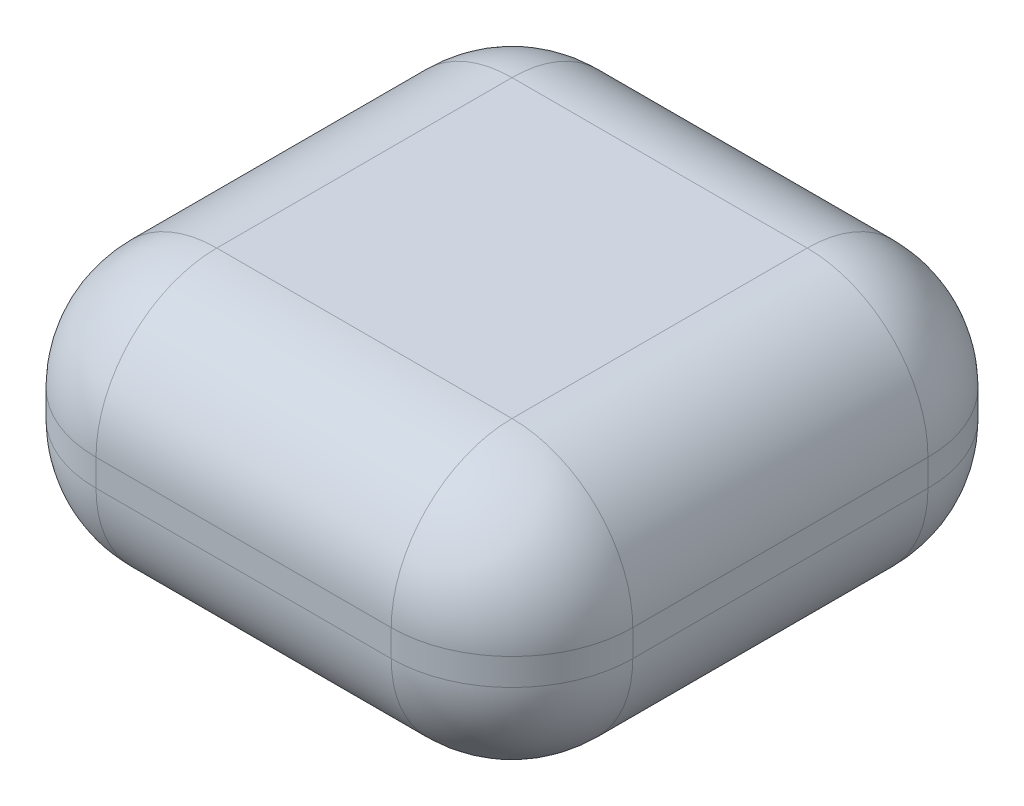
ISO-10303-21;
HEADER;
FILE_DESCRIPTION(('STEP AP214'),'2;1');
FILE_NAME('part.step','',(''),(''),'','','');
FILE_SCHEMA(('AUTOMOTIVE_DESIGN { 1 0 10303 214 1 1 1 1 }'));
ENDSEC;
DATA;
#1=APPLICATION_CONTEXT('core data for automotive mechanical design processes');
#2=APPLICATION_PROTOCOL_DEFINITION('international standard','automotive_design',2000,#1);
#3=PRODUCT_CONTEXT('',#1,'mechanical');
#4=PRODUCT('Part','Part','',(#3));
#5=PRODUCT_RELATED_PRODUCT_CATEGORY('part','',(#4));
#6=PRODUCT_DEFINITION_FORMATION('','',#4);
#7=PRODUCT_DEFINITION_CONTEXT('part definition',#1,'design');
#8=PRODUCT_DEFINITION('design','',#6,#7);
#9=PRODUCT_DEFINITION_SHAPE('','',#8);
#10=(LENGTH_UNIT() NAMED_UNIT(*) SI_UNIT(.MILLI.,.METRE.));
#11=(NAMED_UNIT(*) PLANE_ANGLE_UNIT() SI_UNIT($,.RADIAN.));
#12=(NAMED_UNIT(*) SI_UNIT($,.STERADIAN.) SOLID_ANGLE_UNIT());
#13=UNCERTAINTY_MEASURE_WITH_UNIT(LENGTH_MEASURE(1.E-05),#10,'distance_accuracy_value','');
#14=(GEOMETRIC_REPRESENTATION_CONTEXT(3) GLOBAL_UNCERTAINTY_ASSIGNED_CONTEXT((#13)) GLOBAL_UNIT_ASSIGNED_CONTEXT((#10,
#11,#12)) REPRESENTATION_CONTEXT('',''));
#15=CARTESIAN_POINT('',(0.,0.,0.));
#16=DIRECTION('',(0.,0.,1.));
#17=DIRECTION('',(1.,0.,0.));
#18=AXIS2_PLACEMENT_3D('',#15,#16,#17);
#19=CARTESIAN_POINT('',(100.,-50.,100.));
#20=DIRECTION('',(-1.,0.,0.));
#21=DIRECTION('',(0.,0.,1.));
#22=AXIS2_PLACEMENT_3D('',#19,#20,#21);
#23=PLANE('',#22);
#24=DIRECTION('',(0.,1.,0.));
#25=VECTOR('',#24,1.);
#26=CARTESIAN_POINT('',(100.,-50.,55.));
#27=LINE('',#26,#25);
#28=CARTESIAN_POINT('',(100.,5.,55.));
#29=VERTEX_POINT('',#28);
#30=CARTESIAN_POINT('',(100.,-5.,55.));
#31=VERTEX_POINT('',#30);
#32=EDGE_CURVE('E206',#29,#31,#27,.F.);
#33=ORIENTED_EDGE('',*,*,#32,.T.);
#34=DIRECTION('',(0.,0.,-1.));
#35=VECTOR('',#34,1.);
#36=CARTESIAN_POINT('',(100.,-5.,100.));
#37=LINE('',#36,#35);
#38=CARTESIAN_POINT('',(100.,-5.,-55.));
#39=VERTEX_POINT('',#38);
#40=EDGE_CURVE('E212',#31,#39,#37,.T.);
#41=ORIENTED_EDGE('',*,*,#40,.T.);
#42=DIRECTION('',(0.,1.,0.));
#43=VECTOR('',#42,1.);
#44=CARTESIAN_POINT('',(100.,50.,-55.));
#45=LINE('',#44,#43);
#46=CARTESIAN_POINT('',(100.,5.,-55.));
#47=VERTEX_POINT('',#46);
#48=EDGE_CURVE('E209',#39,#47,#45,.T.);
#49=ORIENTED_EDGE('',*,*,#48,.T.);
#50=DIRECTION('',(0.,0.,-1.));
#51=VECTOR('',#50,1.);
#52=CARTESIAN_POINT('',(100.,5.,100.));
#53=LINE('',#52,#51);
#54=EDGE_CURVE('E203',#47,#29,#53,.F.);
#55=ORIENTED_EDGE('',*,*,#54,.T.);
#56=EDGE_LOOP('',(#33,#41,#49,#55));
#57=FACE_BOUND('',#56,.T.);
#58=ADVANCED_FACE('F39',(#57),#23,.F.);
#59=CARTESIAN_POINT('',(-100.,50.,100.));
#60=DIRECTION('',(0.,-1.,0.));
#61=DIRECTION('',(0.,0.,-1.));
#62=AXIS2_PLACEMENT_3D('',#59,#60,#61);
#63=PLANE('',#62);
#64=DIRECTION('',(-1.,0.,0.));
#65=VECTOR('',#64,1.);
#66=CARTESIAN_POINT('',(-100.,50.,55.));
#67=LINE('',#66,#65);
#68=CARTESIAN_POINT('',(-55.,50.,55.));
#69=VERTEX_POINT('',#68);
#70=CARTESIAN_POINT('',(55.,50.,55.));
#71=VERTEX_POINT('',#70);
#72=EDGE_CURVE('E49',#69,#71,#67,.F.);
#73=ORIENTED_EDGE('',*,*,#72,.T.);
#74=DIRECTION('',(0.,0.,-1.));
#75=VECTOR('',#74,1.);
#76=CARTESIAN_POINT('',(55.,50.,100.));
#77=LINE('',#76,#75);
#78=CARTESIAN_POINT('',(55.,50.,-55.));
#79=VERTEX_POINT('',#78);
#80=EDGE_CURVE('E11',#71,#79,#77,.T.);
#81=ORIENTED_EDGE('',*,*,#80,.T.);
#82=DIRECTION('',(-1.,0.,0.));
#83=VECTOR('',#82,1.);
#84=CARTESIAN_POINT('',(-100.,50.,-55.));
#85=LINE('',#84,#83);
#86=CARTESIAN_POINT('',(-55.,50.,-55.));
#87=VERTEX_POINT('',#86);
#88=EDGE_CURVE('E228',#79,#87,#85,.T.);
#89=ORIENTED_EDGE('',*,*,#88,.T.);
#90=DIRECTION('',(0.,0.,-1.));
#91=VECTOR('',#90,1.);
#92=CARTESIAN_POINT('',(-55.,50.,100.));
#93=LINE('',#92,#91);
#94=EDGE_CURVE('E60',#87,#69,#93,.F.);
#95=ORIENTED_EDGE('',*,*,#94,.T.);
#96=EDGE_LOOP('',(#73,#81,#89,#95));
#97=FACE_BOUND('',#96,.T.);
#98=ADVANCED_FACE('F346',(#97),#63,.F.);
#99=CARTESIAN_POINT('',(-100.,-50.,100.));
#100=DIRECTION('',(1.,0.,0.));
#101=DIRECTION('',(0.,0.,-1.));
#102=AXIS2_PLACEMENT_3D('',#99,#100,#101);
#103=PLANE('',#102);
#104=DIRECTION('',(0.,0.,-1.));
#105=VECTOR('',#104,1.);
#106=CARTESIAN_POINT('',(-100.,5.,100.));
#107=LINE('',#106,#105);
#108=CARTESIAN_POINT('',(-100.,5.,55.));
#109=VERTEX_POINT('',#108);
#110=CARTESIAN_POINT('',(-100.,5.,-55.));
#111=VERTEX_POINT('',#110);
#112=EDGE_CURVE('E132',#109,#111,#107,.T.);
#113=ORIENTED_EDGE('',*,*,#112,.T.);
#114=DIRECTION('',(0.,-1.,0.));
#115=VECTOR('',#114,1.);
#116=CARTESIAN_POINT('',(-100.,-50.,-55.));
#117=LINE('',#116,#115);
#118=CARTESIAN_POINT('',(-100.,-5.,-55.));
#119=VERTEX_POINT('',#118);
#120=EDGE_CURVE('E174',#111,#119,#117,.T.);
#121=ORIENTED_EDGE('',*,*,#120,.T.);
#122=DIRECTION('',(0.,0.,-1.));
#123=VECTOR('',#122,1.);
#124=CARTESIAN_POINT('',(-100.,-5.,100.));
#125=LINE('',#124,#123);
#126=CARTESIAN_POINT('',(-100.,-5.,55.));
#127=VERTEX_POINT('',#126);
#128=EDGE_CURVE('E135',#119,#127,#125,.F.);
#129=ORIENTED_EDGE('',*,*,#128,.T.);
#130=DIRECTION('',(0.,-1.,0.));
#131=VECTOR('',#130,1.);
#132=CARTESIAN_POINT('',(-100.,-50.,55.));
#133=LINE('',#132,#131);
#134=EDGE_CURVE('E127',#127,#109,#133,.F.);
#135=ORIENTED_EDGE('',*,*,#134,.T.);
#136=EDGE_LOOP('',(#113,#121,#129,#135));
#137=FACE_BOUND('',#136,.T.);
#138=ADVANCED_FACE('F129',(#137),#103,.F.);
#139=CARTESIAN_POINT('',(-100.,-50.,100.));
#140=DIRECTION('',(0.,1.,0.));
#141=DIRECTION('',(0.,0.,1.));
#142=AXIS2_PLACEMENT_3D('',#139,#140,#141);
#143=PLANE('',#142);
#144=DIRECTION('',(1.,0.,0.));
#145=VECTOR('',#144,1.);
#146=CARTESIAN_POINT('',(-100.,-50.,55.));
#147=LINE('',#146,#145);
#148=CARTESIAN_POINT('',(55.,-50.,55.));
#149=VERTEX_POINT('',#148);
#150=CARTESIAN_POINT('',(-55.,-50.,55.));
#151=VERTEX_POINT('',#150);
#152=EDGE_CURVE('E190',#149,#151,#147,.F.);
#153=ORIENTED_EDGE('',*,*,#152,.T.);
#154=DIRECTION('',(0.,0.,-1.));
#155=VECTOR('',#154,1.);
#156=CARTESIAN_POINT('',(-55.,-50.,100.));
#157=LINE('',#156,#155);
#158=CARTESIAN_POINT('',(-55.,-50.,-55.));
#159=VERTEX_POINT('',#158);
#160=EDGE_CURVE('E199',#151,#159,#157,.T.);
#161=ORIENTED_EDGE('',*,*,#160,.T.);
#162=DIRECTION('',(1.,0.,0.));
#163=VECTOR('',#162,1.);
#164=CARTESIAN_POINT('',(100.,-50.,-55.));
#165=LINE('',#164,#163);
#166=CARTESIAN_POINT('',(55.,-50.,-55.));
#167=VERTEX_POINT('',#166);
#168=EDGE_CURVE('E196',#159,#167,#165,.T.);
#169=ORIENTED_EDGE('',*,*,#168,.T.);
#170=DIRECTION('',(0.,0.,-1.));
#171=VECTOR('',#170,1.);
#172=CARTESIAN_POINT('',(55.,-50.,100.));
#173=LINE('',#172,#171);
#174=EDGE_CURVE('E193',#167,#149,#173,.F.);
#175=ORIENTED_EDGE('',*,*,#174,.T.);
#176=EDGE_LOOP('',(#153,#161,#169,#175));
#177=FACE_BOUND('',#176,.T.);
#178=ADVANCED_FACE('F329',(#177),#143,.F.);
#179=CARTESIAN_POINT('',(0.,0.,100.));
#180=DIRECTION('',(0.,0.,-1.));
#181=DIRECTION('',(-1.,0.,0.));
#182=AXIS2_PLACEMENT_3D('',#179,#180,#181);
#183=PLANE('',#182);
#184=DIRECTION('',(0.,-1.,0.));
#185=VECTOR('',#184,1.);
#186=CARTESIAN_POINT('',(-55.,0.,100.));
#187=LINE('',#186,#185);
#188=CARTESIAN_POINT('',(-55.,5.,100.));
#189=VERTEX_POINT('',#188);
#190=CARTESIAN_POINT('',(-55.,-5.,100.));
#191=VERTEX_POINT('',#190);
#192=EDGE_CURVE('E146',#189,#191,#187,.T.);
#193=ORIENTED_EDGE('',*,*,#192,.T.);
#194=DIRECTION('',(1.,0.,0.));
#195=VECTOR('',#194,1.);
#196=CARTESIAN_POINT('',(0.,-5.,100.));
#197=LINE('',#196,#195);
#198=CARTESIAN_POINT('',(55.,-5.,100.));
#199=VERTEX_POINT('',#198);
#200=EDGE_CURVE('E224',#191,#199,#197,.T.);
#201=ORIENTED_EDGE('',*,*,#200,.T.);
#202=DIRECTION('',(0.,1.,0.));
#203=VECTOR('',#202,1.);
#204=CARTESIAN_POINT('',(55.,0.,100.));
#205=LINE('',#204,#203);
#206=CARTESIAN_POINT('',(55.,5.,100.));
#207=VERTEX_POINT('',#206);
#208=EDGE_CURVE('E219',#199,#207,#205,.T.);
#209=ORIENTED_EDGE('',*,*,#208,.T.);
#210=DIRECTION('',(-1.,0.,0.));
#211=VECTOR('',#210,1.);
#212=CARTESIAN_POINT('',(0.,5.,100.));
#213=LINE('',#212,#211);
#214=EDGE_CURVE('E216',#207,#189,#213,.T.);
#215=ORIENTED_EDGE('',*,*,#214,.T.);
#216=EDGE_LOOP('',(#193,#201,#209,#215));
#217=FACE_BOUND('',#216,.T.);
#218=ADVANCED_FACE('F316',(#217),#183,.F.);
#219=CARTESIAN_POINT('',(0.,0.,-100.));
#220=DIRECTION('',(0.,0.,-1.));
#221=DIRECTION('',(-1.,0.,0.));
#222=AXIS2_PLACEMENT_3D('',#219,#220,#221);
#223=PLANE('',#222);
#224=DIRECTION('',(1.,0.,0.));
#225=VECTOR('',#224,1.);
#226=CARTESIAN_POINT('',(-100.,-5.,-100.));
#227=LINE('',#226,#225);
#228=CARTESIAN_POINT('',(55.,-5.,-100.));
#229=VERTEX_POINT('',#228);
#230=CARTESIAN_POINT('',(-55.,-5.,-100.));
#231=VERTEX_POINT('',#230);
#232=EDGE_CURVE('E183',#229,#231,#227,.F.);
#233=ORIENTED_EDGE('',*,*,#232,.T.);
#234=DIRECTION('',(0.,-1.,0.));
#235=VECTOR('',#234,1.);
#236=CARTESIAN_POINT('',(-55.,50.,-100.));
#237=LINE('',#236,#235);
#238=CARTESIAN_POINT('',(-55.,5.,-100.));
#239=VERTEX_POINT('',#238);
#240=EDGE_CURVE('E186',#231,#239,#237,.F.);
#241=ORIENTED_EDGE('',*,*,#240,.T.);
#242=DIRECTION('',(-1.,0.,0.));
#243=VECTOR('',#242,1.);
#244=CARTESIAN_POINT('',(100.,5.,-100.));
#245=LINE('',#244,#243);
#246=CARTESIAN_POINT('',(55.,5.,-100.));
#247=VERTEX_POINT('',#246);
#248=EDGE_CURVE('E177',#239,#247,#245,.F.);
#249=ORIENTED_EDGE('',*,*,#248,.T.);
#250=DIRECTION('',(0.,1.,0.));
#251=VECTOR('',#250,1.);
#252=CARTESIAN_POINT('',(55.,-50.,-100.));
#253=LINE('',#252,#251);
#254=EDGE_CURVE('E180',#247,#229,#253,.F.);
#255=ORIENTED_EDGE('',*,*,#254,.T.);
#256=EDGE_LOOP('',(#233,#241,#249,#255));
#257=FACE_BOUND('',#256,.T.);
#258=ADVANCED_FACE('F532',(#257),#223,.T.);
#259=CARTESIAN_POINT('',(55.,0.,55.));
#260=DIRECTION('',(0.,1.,0.));
#261=DIRECTION('',(0.,0.,1.));
#262=AXIS2_PLACEMENT_3D('',#259,#260,#261);
#263=CYLINDRICAL_SURFACE('',#262,45.);
#264=CARTESIAN_POINT('',(55.,5.,55.));
#265=DIRECTION('',(0.,1.,0.));
#266=DIRECTION('',(0.,0.,1.));
#267=AXIS2_PLACEMENT_3D('',#264,#265,#266);
#268=CIRCLE('',#267,45.);
#269=EDGE_CURVE('E43',#207,#29,#268,.T.);
#270=ORIENTED_EDGE('',*,*,#269,.F.);
#271=ORIENTED_EDGE('',*,*,#208,.F.);
#272=CARTESIAN_POINT('',(55.,-5.,55.));
#273=DIRECTION('',(0.,-1.,0.));
#274=DIRECTION('',(0.,0.,-1.));
#275=AXIS2_PLACEMENT_3D('',#272,#273,#274);
#276=CIRCLE('',#275,45.);
#277=EDGE_CURVE('E170',#31,#199,#276,.T.);
#278=ORIENTED_EDGE('',*,*,#277,.F.);
#279=ORIENTED_EDGE('',*,*,#32,.F.);
#280=EDGE_LOOP('',(#270,#271,#278,#279));
#281=FACE_BOUND('',#280,.T.);
#282=ADVANCED_FACE('F41',(#281),#263,.T.);
#283=CARTESIAN_POINT('',(55.,5.,55.));
#284=DIRECTION('',(0.,0.,1.));
#285=DIRECTION('',(1.,0.,0.));
#286=AXIS2_PLACEMENT_3D('',#283,#284,#285);
#287=SPHERICAL_SURFACE('',#286,45.);
#288=CARTESIAN_POINT('',(55.,5.,55.));
#289=DIRECTION('',(1.,0.,0.));
#290=DIRECTION('',(0.,0.,-1.));
#291=AXIS2_PLACEMENT_3D('',#288,#289,#290);
#292=CIRCLE('',#291,45.);
#293=EDGE_CURVE('E294',#207,#71,#292,.F.);
#294=ORIENTED_EDGE('',*,*,#293,.F.);
#295=ORIENTED_EDGE('',*,*,#269,.T.);
#296=CARTESIAN_POINT('',(55.,5.,55.));
#297=DIRECTION('',(0.,0.,1.));
#298=DIRECTION('',(1.,0.,0.));
#299=AXIS2_PLACEMENT_3D('',#296,#297,#298);
#300=CIRCLE('',#299,45.);
#301=EDGE_CURVE('E297',#71,#29,#300,.F.);
#302=ORIENTED_EDGE('',*,*,#301,.F.);
#303=EDGE_LOOP('',(#294,#295,#302));
#304=FACE_BOUND('',#303,.T.);
#305=ADVANCED_FACE('F339',(#304),#287,.T.);
#306=CARTESIAN_POINT('',(55.,-5.,55.));
#307=DIRECTION('',(0.,0.,1.));
#308=DIRECTION('',(1.,0.,0.));
#309=AXIS2_PLACEMENT_3D('',#306,#307,#308);
#310=SPHERICAL_SURFACE('',#309,45.);
#311=CARTESIAN_POINT('',(55.,-5.,55.));
#312=DIRECTION('',(0.,0.,1.));
#313=DIRECTION('',(1.,0.,0.));
#314=AXIS2_PLACEMENT_3D('',#311,#312,#313);
#315=CIRCLE('',#314,45.);
#316=EDGE_CURVE('E287',#31,#149,#315,.F.);
#317=ORIENTED_EDGE('',*,*,#316,.F.);
#318=ORIENTED_EDGE('',*,*,#277,.T.);
#319=CARTESIAN_POINT('',(55.,-5.,55.));
#320=DIRECTION('',(1.,0.,0.));
#321=DIRECTION('',(0.,0.,-1.));
#322=AXIS2_PLACEMENT_3D('',#319,#320,#321);
#323=CIRCLE('',#322,45.);
#324=EDGE_CURVE('E291',#149,#199,#323,.F.);
#325=ORIENTED_EDGE('',*,*,#324,.F.);
#326=EDGE_LOOP('',(#317,#318,#325));
#327=FACE_BOUND('',#326,.T.);
#328=ADVANCED_FACE('F307',(#327),#310,.T.);
#329=CARTESIAN_POINT('',(55.,5.,100.));
#330=DIRECTION('',(0.,0.,-1.));
#331=DIRECTION('',(-1.,0.,0.));
#332=AXIS2_PLACEMENT_3D('',#329,#330,#331);
#333=CYLINDRICAL_SURFACE('',#332,45.);
#334=ORIENTED_EDGE('',*,*,#301,.T.);
#335=ORIENTED_EDGE('',*,*,#54,.F.);
#336=CARTESIAN_POINT('',(55.,5.,-55.));
#337=DIRECTION('',(0.,0.,-1.));
#338=DIRECTION('',(-1.,0.,0.));
#339=AXIS2_PLACEMENT_3D('',#336,#337,#338);
#340=CIRCLE('',#339,45.);
#341=EDGE_CURVE('E279',#79,#47,#340,.T.);
#342=ORIENTED_EDGE('',*,*,#341,.F.);
#343=ORIENTED_EDGE('',*,*,#80,.F.);
#344=EDGE_LOOP('',(#334,#335,#342,#343));
#345=FACE_BOUND('',#344,.T.);
#346=ADVANCED_FACE('F343',(#345),#333,.T.);
#347=CARTESIAN_POINT('',(0.,5.,55.));
#348=DIRECTION('',(-1.,0.,0.));
#349=DIRECTION('',(0.,0.,1.));
#350=AXIS2_PLACEMENT_3D('',#347,#348,#349);
#351=CYLINDRICAL_SURFACE('',#350,45.);
#352=ORIENTED_EDGE('',*,*,#293,.T.);
#353=ORIENTED_EDGE('',*,*,#72,.F.);
#354=CARTESIAN_POINT('',(-55.,5.,55.));
#355=DIRECTION('',(-1.,0.,0.));
#356=DIRECTION('',(0.,0.,1.));
#357=AXIS2_PLACEMENT_3D('',#354,#355,#356);
#358=CIRCLE('',#357,45.);
#359=EDGE_CURVE('E151',#189,#69,#358,.T.);
#360=ORIENTED_EDGE('',*,*,#359,.F.);
#361=ORIENTED_EDGE('',*,*,#214,.F.);
#362=EDGE_LOOP('',(#352,#353,#360,#361));
#363=FACE_BOUND('',#362,.T.);
#364=ADVANCED_FACE('F496',(#363),#351,.T.);
#365=CARTESIAN_POINT('',(-55.,0.,55.));
#366=DIRECTION('',(0.,-1.,0.));
#367=DIRECTION('',(0.,0.,-1.));
#368=AXIS2_PLACEMENT_3D('',#365,#366,#367);
#369=CYLINDRICAL_SURFACE('',#368,45.);
#370=CARTESIAN_POINT('',(-55.,-5.,55.));
#371=DIRECTION('',(0.,-1.,0.));
#372=DIRECTION('',(0.,0.,-1.));
#373=AXIS2_PLACEMENT_3D('',#370,#371,#372);
#374=CIRCLE('',#373,45.);
#375=EDGE_CURVE('E152',#191,#127,#374,.T.);
#376=ORIENTED_EDGE('',*,*,#375,.F.);
#377=ORIENTED_EDGE('',*,*,#192,.F.);
#378=CARTESIAN_POINT('',(-55.,5.,55.));
#379=DIRECTION('',(0.,1.,0.));
#380=DIRECTION('',(0.,0.,1.));
#381=AXIS2_PLACEMENT_3D('',#378,#379,#380);
#382=CIRCLE('',#381,45.);
#383=EDGE_CURVE('E143',#109,#189,#382,.T.);
#384=ORIENTED_EDGE('',*,*,#383,.F.);
#385=ORIENTED_EDGE('',*,*,#134,.F.);
#386=EDGE_LOOP('',(#376,#377,#384,#385));
#387=FACE_BOUND('',#386,.T.);
#388=ADVANCED_FACE('F145',(#387),#369,.T.);
#389=CARTESIAN_POINT('',(0.,-5.,55.));
#390=DIRECTION('',(1.,0.,0.));
#391=DIRECTION('',(0.,0.,-1.));
#392=AXIS2_PLACEMENT_3D('',#389,#390,#391);
#393=CYLINDRICAL_SURFACE('',#392,45.);
#394=ORIENTED_EDGE('',*,*,#324,.T.);
#395=ORIENTED_EDGE('',*,*,#200,.F.);
#396=CARTESIAN_POINT('',(-55.,-5.,55.));
#397=DIRECTION('',(-1.,0.,0.));
#398=DIRECTION('',(0.,0.,1.));
#399=AXIS2_PLACEMENT_3D('',#396,#397,#398);
#400=CIRCLE('',#399,45.);
#401=EDGE_CURVE('E271',#151,#191,#400,.T.);
#402=ORIENTED_EDGE('',*,*,#401,.F.);
#403=ORIENTED_EDGE('',*,*,#152,.F.);
#404=EDGE_LOOP('',(#394,#395,#402,#403));
#405=FACE_BOUND('',#404,.T.);
#406=ADVANCED_FACE('F319',(#405),#393,.T.);
#407=CARTESIAN_POINT('',(55.,-5.,100.));
#408=DIRECTION('',(0.,0.,-1.));
#409=DIRECTION('',(-1.,0.,0.));
#410=AXIS2_PLACEMENT_3D('',#407,#408,#409);
#411=CYLINDRICAL_SURFACE('',#410,45.);
#412=ORIENTED_EDGE('',*,*,#316,.T.);
#413=ORIENTED_EDGE('',*,*,#174,.F.);
#414=CARTESIAN_POINT('',(55.,-5.,-55.));
#415=DIRECTION('',(0.,0.,-1.));
#416=DIRECTION('',(-1.,0.,0.));
#417=AXIS2_PLACEMENT_3D('',#414,#415,#416);
#418=CIRCLE('',#417,45.);
#419=EDGE_CURVE('E267',#39,#167,#418,.T.);
#420=ORIENTED_EDGE('',*,*,#419,.F.);
#421=ORIENTED_EDGE('',*,*,#40,.F.);
#422=EDGE_LOOP('',(#412,#413,#420,#421));
#423=FACE_BOUND('',#422,.T.);
#424=ADVANCED_FACE('F333',(#423),#411,.T.);
#425=CARTESIAN_POINT('',(55.,-50.,-55.));
#426=DIRECTION('',(0.,-1.,0.));
#427=DIRECTION('',(0.,0.,-1.));
#428=AXIS2_PLACEMENT_3D('',#425,#426,#427);
#429=CYLINDRICAL_SURFACE('',#428,45.);
#430=CARTESIAN_POINT('',(55.,5.,-55.));
#431=DIRECTION('',(0.,1.,0.));
#432=DIRECTION('',(0.,0.,1.));
#433=AXIS2_PLACEMENT_3D('',#430,#431,#432);
#434=CIRCLE('',#433,45.);
#435=EDGE_CURVE('E283',#47,#247,#434,.T.);
#436=ORIENTED_EDGE('',*,*,#435,.F.);
#437=ORIENTED_EDGE('',*,*,#48,.F.);
#438=CARTESIAN_POINT('',(55.,-5.,-55.));
#439=DIRECTION('',(0.,-1.,0.));
#440=DIRECTION('',(0.,0.,-1.));
#441=AXIS2_PLACEMENT_3D('',#438,#439,#440);
#442=CIRCLE('',#441,45.);
#443=EDGE_CURVE('E264',#229,#39,#442,.T.);
#444=ORIENTED_EDGE('',*,*,#443,.F.);
#445=ORIENTED_EDGE('',*,*,#254,.F.);
#446=EDGE_LOOP('',(#436,#437,#444,#445));
#447=FACE_BOUND('',#446,.T.);
#448=ADVANCED_FACE('F371',(#447),#429,.T.);
#449=CARTESIAN_POINT('',(55.,5.,-55.));
#450=DIRECTION('',(0.,0.,1.));
#451=DIRECTION('',(1.,0.,0.));
#452=AXIS2_PLACEMENT_3D('',#449,#450,#451);
#453=SPHERICAL_SURFACE('',#452,45.);
#454=ORIENTED_EDGE('',*,*,#341,.T.);
#455=ORIENTED_EDGE('',*,*,#435,.T.);
#456=CARTESIAN_POINT('',(55.,5.,-55.));
#457=DIRECTION('',(1.,0.,0.));
#458=DIRECTION('',(0.,1.,0.));
#459=AXIS2_PLACEMENT_3D('',#456,#457,#458);
#460=CIRCLE('',#459,45.);
#461=EDGE_CURVE('E159',#79,#247,#460,.F.);
#462=ORIENTED_EDGE('',*,*,#461,.F.);
#463=EDGE_LOOP('',(#454,#455,#462));
#464=FACE_BOUND('',#463,.T.);
#465=ADVANCED_FACE('F373',(#464),#453,.T.);
#466=CARTESIAN_POINT('',(-55.,5.,55.));
#467=DIRECTION('',(0.,0.,1.));
#468=DIRECTION('',(1.,0.,0.));
#469=AXIS2_PLACEMENT_3D('',#466,#467,#468);
#470=SPHERICAL_SURFACE('',#469,45.);
#471=ORIENTED_EDGE('',*,*,#383,.T.);
#472=ORIENTED_EDGE('',*,*,#359,.T.);
#473=CARTESIAN_POINT('',(-55.,5.,55.));
#474=DIRECTION('',(0.,0.,1.));
#475=DIRECTION('',(1.,0.,0.));
#476=AXIS2_PLACEMENT_3D('',#473,#474,#475);
#477=CIRCLE('',#476,45.);
#478=EDGE_CURVE('E155',#109,#69,#477,.F.);
#479=ORIENTED_EDGE('',*,*,#478,.F.);
#480=EDGE_LOOP('',(#471,#472,#479));
#481=FACE_BOUND('',#480,.T.);
#482=ADVANCED_FACE('F156',(#481),#470,.T.);
#483=CARTESIAN_POINT('',(-55.,-5.,55.));
#484=DIRECTION('',(0.,0.,1.));
#485=DIRECTION('',(1.,0.,0.));
#486=AXIS2_PLACEMENT_3D('',#483,#484,#485);
#487=SPHERICAL_SURFACE('',#486,45.);
#488=ORIENTED_EDGE('',*,*,#401,.T.);
#489=ORIENTED_EDGE('',*,*,#375,.T.);
#490=CARTESIAN_POINT('',(-55.,-5.,55.));
#491=DIRECTION('',(0.,0.,1.));
#492=DIRECTION('',(1.,0.,0.));
#493=AXIS2_PLACEMENT_3D('',#490,#491,#492);
#494=CIRCLE('',#493,45.);
#495=EDGE_CURVE('E160',#151,#127,#494,.F.);
#496=ORIENTED_EDGE('',*,*,#495,.F.);
#497=EDGE_LOOP('',(#488,#489,#496));
#498=FACE_BOUND('',#497,.T.);
#499=ADVANCED_FACE('F322',(#498),#487,.T.);
#500=CARTESIAN_POINT('',(55.,-5.,-55.));
#501=DIRECTION('',(0.,0.,1.));
#502=DIRECTION('',(1.,0.,0.));
#503=AXIS2_PLACEMENT_3D('',#500,#501,#502);
#504=SPHERICAL_SURFACE('',#503,45.);
#505=ORIENTED_EDGE('',*,*,#443,.T.);
#506=ORIENTED_EDGE('',*,*,#419,.T.);
#507=CARTESIAN_POINT('',(55.,-5.,-55.));
#508=DIRECTION('',(1.,0.,0.));
#509=DIRECTION('',(0.,0.,-1.));
#510=AXIS2_PLACEMENT_3D('',#507,#508,#509);
#511=CIRCLE('',#510,45.);
#512=EDGE_CURVE('E254',#229,#167,#511,.F.);
#513=ORIENTED_EDGE('',*,*,#512,.F.);
#514=EDGE_LOOP('',(#505,#506,#513));
#515=FACE_BOUND('',#514,.T.);
#516=ADVANCED_FACE('F367',(#515),#504,.T.);
#517=CARTESIAN_POINT('',(-100.,5.,-55.));
#518=DIRECTION('',(1.,0.,0.));
#519=DIRECTION('',(0.,0.,-1.));
#520=AXIS2_PLACEMENT_3D('',#517,#518,#519);
#521=CYLINDRICAL_SURFACE('',#520,45.);
#522=ORIENTED_EDGE('',*,*,#461,.T.);
#523=ORIENTED_EDGE('',*,*,#248,.F.);
#524=CARTESIAN_POINT('',(-55.,5.,-55.));
#525=DIRECTION('',(-1.,0.,0.));
#526=DIRECTION('',(0.,0.,1.));
#527=AXIS2_PLACEMENT_3D('',#524,#525,#526);
#528=CIRCLE('',#527,45.);
#529=EDGE_CURVE('E250',#87,#239,#528,.T.);
#530=ORIENTED_EDGE('',*,*,#529,.F.);
#531=ORIENTED_EDGE('',*,*,#88,.F.);
#532=EDGE_LOOP('',(#522,#523,#530,#531));
#533=FACE_BOUND('',#532,.T.);
#534=ADVANCED_FACE('F351',(#533),#521,.T.);
#535=CARTESIAN_POINT('',(-55.,5.,100.));
#536=DIRECTION('',(0.,0.,-1.));
#537=DIRECTION('',(-1.,0.,0.));
#538=AXIS2_PLACEMENT_3D('',#535,#536,#537);
#539=CYLINDRICAL_SURFACE('',#538,45.);
#540=ORIENTED_EDGE('',*,*,#478,.T.);
#541=ORIENTED_EDGE('',*,*,#94,.F.);
#542=CARTESIAN_POINT('',(-55.,5.,-55.));
#543=DIRECTION('',(0.,0.,-1.));
#544=DIRECTION('',(-1.,0.,0.));
#545=AXIS2_PLACEMENT_3D('',#542,#543,#544);
#546=CIRCLE('',#545,45.);
#547=EDGE_CURVE('E164',#111,#87,#546,.T.);
#548=ORIENTED_EDGE('',*,*,#547,.F.);
#549=ORIENTED_EDGE('',*,*,#112,.F.);
#550=EDGE_LOOP('',(#540,#541,#548,#549));
#551=FACE_BOUND('',#550,.T.);
#552=ADVANCED_FACE('F162',(#551),#539,.T.);
#553=CARTESIAN_POINT('',(-55.,-5.,100.));
#554=DIRECTION('',(0.,0.,-1.));
#555=DIRECTION('',(-1.,0.,0.));
#556=AXIS2_PLACEMENT_3D('',#553,#554,#555);
#557=CYLINDRICAL_SURFACE('',#556,45.);
#558=ORIENTED_EDGE('',*,*,#495,.T.);
#559=ORIENTED_EDGE('',*,*,#128,.F.);
#560=CARTESIAN_POINT('',(-55.,-5.,-55.));
#561=DIRECTION('',(0.,0.,-1.));
#562=DIRECTION('',(-1.,0.,0.));
#563=AXIS2_PLACEMENT_3D('',#560,#561,#562);
#564=CIRCLE('',#563,45.);
#565=EDGE_CURVE('E244',#159,#119,#564,.T.);
#566=ORIENTED_EDGE('',*,*,#565,.F.);
#567=ORIENTED_EDGE('',*,*,#160,.F.);
#568=EDGE_LOOP('',(#558,#559,#566,#567));
#569=FACE_BOUND('',#568,.T.);
#570=ADVANCED_FACE('F326',(#569),#557,.T.);
#571=CARTESIAN_POINT('',(-100.,-5.,-55.));
#572=DIRECTION('',(-1.,0.,0.));
#573=DIRECTION('',(0.,0.,1.));
#574=AXIS2_PLACEMENT_3D('',#571,#572,#573);
#575=CYLINDRICAL_SURFACE('',#574,45.);
#576=ORIENTED_EDGE('',*,*,#512,.T.);
#577=ORIENTED_EDGE('',*,*,#168,.F.);
#578=CARTESIAN_POINT('',(-55.,-5.,-55.));
#579=DIRECTION('',(-1.,0.,0.));
#580=DIRECTION('',(0.,0.,1.));
#581=AXIS2_PLACEMENT_3D('',#578,#579,#580);
#582=CIRCLE('',#581,45.);
#583=EDGE_CURVE('E241',#231,#159,#582,.T.);
#584=ORIENTED_EDGE('',*,*,#583,.F.);
#585=ORIENTED_EDGE('',*,*,#232,.F.);
#586=EDGE_LOOP('',(#576,#577,#584,#585));
#587=FACE_BOUND('',#586,.T.);
#588=ADVANCED_FACE('F364',(#587),#575,.T.);
#589=CARTESIAN_POINT('',(-55.,5.,-55.));
#590=DIRECTION('',(0.,0.,1.));
#591=DIRECTION('',(1.,0.,0.));
#592=AXIS2_PLACEMENT_3D('',#589,#590,#591);
#593=SPHERICAL_SURFACE('',#592,45.);
#594=ORIENTED_EDGE('',*,*,#547,.T.);
#595=ORIENTED_EDGE('',*,*,#529,.T.);
#596=CARTESIAN_POINT('',(-55.,5.,-55.));
#597=DIRECTION('',(0.,1.,0.));
#598=DIRECTION('',(0.,0.,1.));
#599=AXIS2_PLACEMENT_3D('',#596,#597,#598);
#600=CIRCLE('',#599,45.);
#601=EDGE_CURVE('E238',#111,#239,#600,.F.);
#602=ORIENTED_EDGE('',*,*,#601,.F.);
#603=EDGE_LOOP('',(#594,#595,#602));
#604=FACE_BOUND('',#603,.T.);
#605=ADVANCED_FACE('F353',(#604),#593,.T.);
#606=CARTESIAN_POINT('',(-55.,-5.,-55.));
#607=DIRECTION('',(0.,0.,1.));
#608=DIRECTION('',(1.,0.,0.));
#609=AXIS2_PLACEMENT_3D('',#606,#607,#608);
#610=SPHERICAL_SURFACE('',#609,45.);
#611=ORIENTED_EDGE('',*,*,#583,.T.);
#612=ORIENTED_EDGE('',*,*,#565,.T.);
#613=CARTESIAN_POINT('',(-55.,-5.,-55.));
#614=DIRECTION('',(0.,-1.,0.));
#615=DIRECTION('',(0.,0.,-1.));
#616=AXIS2_PLACEMENT_3D('',#613,#614,#615);
#617=CIRCLE('',#616,45.);
#618=EDGE_CURVE('E235',#231,#119,#617,.F.);
#619=ORIENTED_EDGE('',*,*,#618,.F.);
#620=EDGE_LOOP('',(#611,#612,#619));
#621=FACE_BOUND('',#620,.T.);
#622=ADVANCED_FACE('F360',(#621),#610,.T.);
#623=CARTESIAN_POINT('',(-55.,-50.,-55.));
#624=DIRECTION('',(0.,1.,0.));
#625=DIRECTION('',(0.,0.,1.));
#626=AXIS2_PLACEMENT_3D('',#623,#624,#625);
#627=CYLINDRICAL_SURFACE('',#626,45.);
#628=ORIENTED_EDGE('',*,*,#601,.T.);
#629=ORIENTED_EDGE('',*,*,#240,.F.);
#630=ORIENTED_EDGE('',*,*,#618,.T.);
#631=ORIENTED_EDGE('',*,*,#120,.F.);
#632=EDGE_LOOP('',(#628,#629,#630,#631));
#633=FACE_BOUND('',#632,.T.);
#634=ADVANCED_FACE('F357',(#633),#627,.T.);
#635=CLOSED_SHELL('',(#58,#98,#138,#178,#218,#258,#282,#305,#328,#346,#364,#388,#406,#424,#448,
#465,#482,#499,#516,#534,#552,#570,#588,#605,#622,#634));
#636=MANIFOLD_SOLID_BREP('B2',#635);
#637=ADVANCED_BREP_SHAPE_REPRESENTATION('',(#18,#636),#14);
#638=SHAPE_DEFINITION_REPRESENTATION(#9,#637);
ENDSEC;
END-ISO-10303-21;
